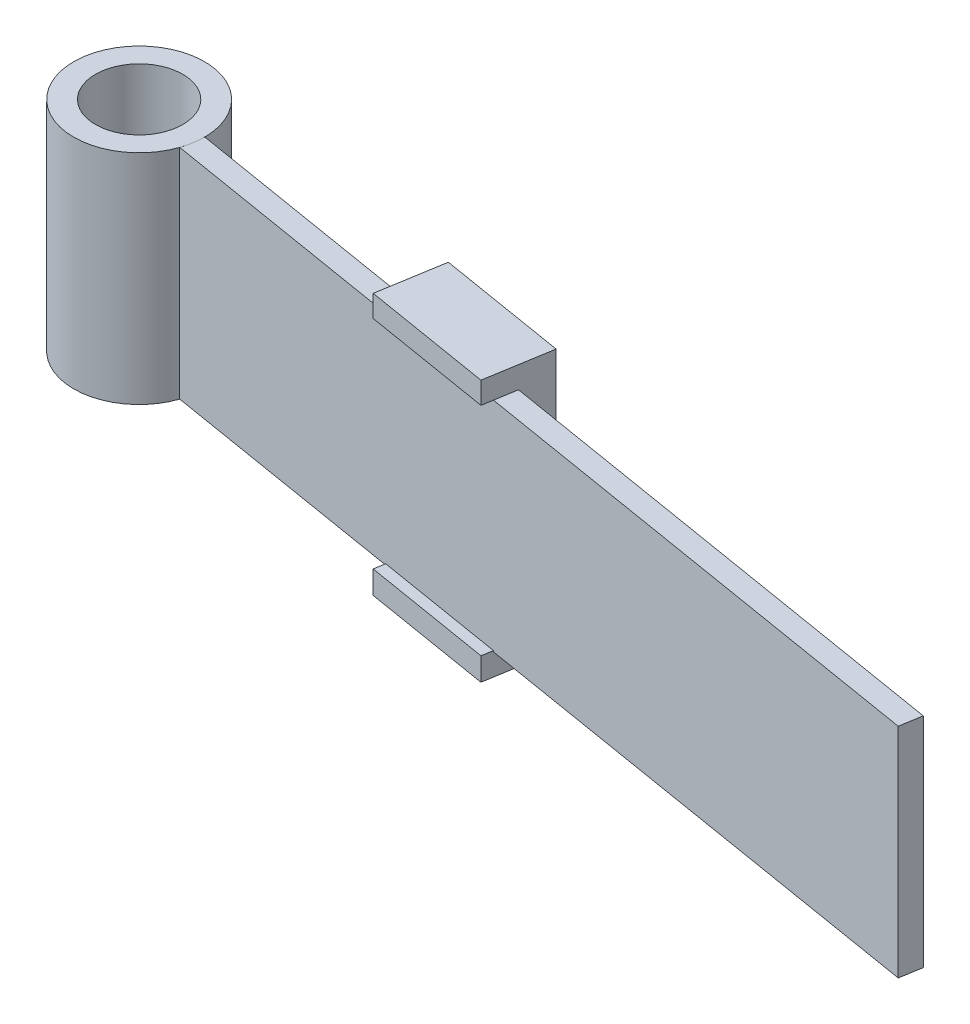
ISO-10303-21;
HEADER;
FILE_DESCRIPTION(('STEP AP214'),'2;1');
FILE_NAME('part.step','',(''),(''),'','','');
FILE_SCHEMA(('AUTOMOTIVE_DESIGN { 1 0 10303 214 1 1 1 1 }'));
ENDSEC;
DATA;
#1=APPLICATION_CONTEXT('core data for automotive mechanical design processes');
#2=APPLICATION_PROTOCOL_DEFINITION('international standard','automotive_design',2000,#1);
#3=PRODUCT_CONTEXT('',#1,'mechanical');
#4=PRODUCT('Part','Part','',(#3));
#5=PRODUCT_RELATED_PRODUCT_CATEGORY('part','',(#4));
#6=PRODUCT_DEFINITION_FORMATION('','',#4);
#7=PRODUCT_DEFINITION_CONTEXT('part definition',#1,'design');
#8=PRODUCT_DEFINITION('design','',#6,#7);
#9=PRODUCT_DEFINITION_SHAPE('','',#8);
#10=(LENGTH_UNIT() NAMED_UNIT(*) SI_UNIT(.MILLI.,.METRE.));
#11=(NAMED_UNIT(*) PLANE_ANGLE_UNIT() SI_UNIT($,.RADIAN.));
#12=(NAMED_UNIT(*) SI_UNIT($,.STERADIAN.) SOLID_ANGLE_UNIT());
#13=UNCERTAINTY_MEASURE_WITH_UNIT(LENGTH_MEASURE(1.E-05),#10,'distance_accuracy_value','');
#14=(GEOMETRIC_REPRESENTATION_CONTEXT(3) GLOBAL_UNCERTAINTY_ASSIGNED_CONTEXT((#13)) GLOBAL_UNIT_ASSIGNED_CONTEXT((#10,
#11,#12)) REPRESENTATION_CONTEXT('',''));
#15=CARTESIAN_POINT('',(0.,0.,0.));
#16=DIRECTION('',(0.,0.,1.));
#17=DIRECTION('',(1.,0.,0.));
#18=AXIS2_PLACEMENT_3D('',#15,#16,#17);
#19=CARTESIAN_POINT('',(-16.9690297326158,61.887307151711,30.7149030524795));
#20=DIRECTION('',(0.,-1.,0.));
#21=DIRECTION('',(0.,0.,-1.));
#22=AXIS2_PLACEMENT_3D('',#19,#20,#21);
#23=CYLINDRICAL_SURFACE('',#22,3.81);
#24=CARTESIAN_POINT('',(-16.9690297326158,61.887307151711,30.7149030524795));
#25=DIRECTION('',(0.,1.,0.));
#26=DIRECTION('',(0.,0.,1.));
#27=AXIS2_PLACEMENT_3D('',#24,#25,#26);
#28=CIRCLE('',#27,3.81);
#29=CARTESIAN_POINT('',(-16.9690297326158,61.887307151711,34.5249030524795));
#30=VERTEX_POINT('',#29);
#31=EDGE_CURVE('P0_E10',#30,#30,#28,.T.);
#32=ORIENTED_EDGE('',*,*,#31,.F.);
#33=EDGE_LOOP('',(#32));
#34=FACE_BOUND('',#33,.T.);
#35=CARTESIAN_POINT('',(-16.9690297326158,49.187307151711,30.7149030524795));
#36=DIRECTION('',(0.,1.,0.));
#37=DIRECTION('',(0.,0.,1.));
#38=AXIS2_PLACEMENT_3D('',#35,#36,#37);
#39=CIRCLE('',#38,3.81);
#40=CARTESIAN_POINT('',(-16.9690297326158,49.187307151711,34.5249030524795));
#41=VERTEX_POINT('',#40);
#42=EDGE_CURVE('P0_E18',#41,#41,#39,.T.);
#43=ORIENTED_EDGE('',*,*,#42,.T.);
#44=EDGE_LOOP('',(#43));
#45=FACE_BOUND('',#44,.T.);
#46=ADVANCED_FACE('P0_F15',(#34,#45),#23,.T.);
#47=CARTESIAN_POINT('',(-16.9690297326158,61.887307151711,30.7149030524795));
#48=DIRECTION('',(0.,1.,0.));
#49=DIRECTION('',(0.,0.,1.));
#50=AXIS2_PLACEMENT_3D('',#47,#48,#49);
#51=PLANE('',#50);
#52=CARTESIAN_POINT('',(-16.9690297326158,61.887307151711,30.7149030524795));
#53=DIRECTION('',(0.,1.,0.));
#54=DIRECTION('',(0.,0.,1.));
#55=AXIS2_PLACEMENT_3D('',#52,#53,#54);
#56=CIRCLE('',#55,2.54);
#57=CARTESIAN_POINT('',(-16.9690297326158,61.887307151711,33.2549030524795));
#58=VERTEX_POINT('',#57);
#59=EDGE_CURVE('P0_E27',#58,#58,#56,.T.);
#60=ORIENTED_EDGE('',*,*,#59,.F.);
#61=EDGE_LOOP('',(#60));
#62=FACE_BOUND('',#61,.T.);
#63=ORIENTED_EDGE('',*,*,#31,.T.);
#64=EDGE_LOOP('',(#63));
#65=FACE_BOUND('',#64,.T.);
#66=ADVANCED_FACE('P0_F42',(#62,#65),#51,.T.);
#67=CARTESIAN_POINT('',(-16.9690297326158,49.187307151711,30.7149030524795));
#68=DIRECTION('',(0.,1.,0.));
#69=DIRECTION('',(0.,0.,1.));
#70=AXIS2_PLACEMENT_3D('',#67,#68,#69);
#71=PLANE('',#70);
#72=CARTESIAN_POINT('',(-16.9690297326158,49.187307151711,30.7149030524795));
#73=DIRECTION('',(0.,1.,0.));
#74=DIRECTION('',(0.,0.,1.));
#75=AXIS2_PLACEMENT_3D('',#72,#73,#74);
#76=CIRCLE('',#75,2.54);
#77=CARTESIAN_POINT('',(-16.9690297326158,49.187307151711,33.2549030524795));
#78=VERTEX_POINT('',#77);
#79=EDGE_CURVE('P0_E25',#78,#78,#76,.T.);
#80=ORIENTED_EDGE('',*,*,#79,.T.);
#81=EDGE_LOOP('',(#80));
#82=FACE_BOUND('',#81,.T.);
#83=ORIENTED_EDGE('',*,*,#42,.F.);
#84=EDGE_LOOP('',(#83));
#85=FACE_BOUND('',#84,.T.);
#86=ADVANCED_FACE('P0_F33',(#82,#85),#71,.F.);
#87=CARTESIAN_POINT('',(-16.9690297326158,49.187307151711,30.7149030524795));
#88=DIRECTION('',(0.,1.,0.));
#89=DIRECTION('',(0.,0.,1.));
#90=AXIS2_PLACEMENT_3D('',#87,#88,#89);
#91=CYLINDRICAL_SURFACE('',#90,2.54);
#92=ORIENTED_EDGE('',*,*,#79,.F.);
#93=EDGE_LOOP('',(#92));
#94=FACE_BOUND('',#93,.T.);
#95=ORIENTED_EDGE('',*,*,#59,.T.);
#96=EDGE_LOOP('',(#95));
#97=FACE_BOUND('',#96,.T.);
#98=ADVANCED_FACE('P0_F36',(#94,#97),#91,.F.);
#99=CLOSED_SHELL('',(#46,#66,#86,#98));
#100=MANIFOLD_SOLID_BREP('P0_B1',#99);
#101=CARTESIAN_POINT('',(-13.159057779006,61.887307151711,30.7002841361616));
#102=DIRECTION('',(0.,-1.,0.));
#103=DIRECTION('',(-0.162882120661811,0.,0.986645536537166));
#104=AXIS2_PLACEMENT_3D('',#101,#102,#103);
#105=PLANE('',#104);
#106=DIRECTION('',(0.986645536537166,0.,0.162882120661811));
#107=VECTOR('',#106,1.);
#108=CARTESIAN_POINT('',(-13.159057779006,61.887307151711,30.7002841361616));
#109=LINE('',#108,#107);
#110=CARTESIAN_POINT('',(-13.159057779006,61.887307151711,30.7002841361616));
#111=VERTEX_POINT('',#110);
#112=CARTESIAN_POINT('',(36.962535477082,61.8873071517111,38.9746958657816));
#113=VERTEX_POINT('',#112);
#114=EDGE_CURVE('P1_E10',#111,#113,#109,.T.);
#115=ORIENTED_EDGE('',*,*,#114,.F.);
#116=CARTESIAN_POINT('',(-16.9690297326148,61.887307151711,30.7149030524796));
#117=DIRECTION('',(0.,-1.,0.));
#118=DIRECTION('',(-0.162882120661811,0.,0.986645536537166));
#119=AXIS2_PLACEMENT_3D('',#116,#117,#118);
#120=CIRCLE('',#119,3.81);
#121=CARTESIAN_POINT('',(-13.3659180722465,61.887307151711,31.9533239675638));
#122=VERTEX_POINT('',#121);
#123=EDGE_CURVE('P1_E82',#111,#122,#120,.T.);
#124=ORIENTED_EDGE('',*,*,#123,.T.);
#125=DIRECTION('',(0.986645536537166,0.,0.162882120661811));
#126=VECTOR('',#125,1.);
#127=CARTESIAN_POINT('',(-13.3659180722465,61.887307151711,31.9533239675638));
#128=LINE('',#127,#126);
#129=CARTESIAN_POINT('',(36.7556751838415,61.8873071517111,40.2277356971838));
#130=VERTEX_POINT('',#129);
#131=EDGE_CURVE('P1_E64',#122,#130,#128,.T.);
#132=ORIENTED_EDGE('',*,*,#131,.T.);
#133=DIRECTION('',(0.162882120661811,0.,-0.986645536537166));
#134=VECTOR('',#133,1.);
#135=CARTESIAN_POINT('',(36.962535477082,61.8873071517111,38.9746958657816));
#136=LINE('',#135,#134);
#137=EDGE_CURVE('P1_E69',#130,#113,#136,.T.);
#138=ORIENTED_EDGE('',*,*,#137,.T.);
#139=EDGE_LOOP('',(#115,#124,#132,#138));
#140=FACE_BOUND('',#139,.T.);
#141=ADVANCED_FACE('P1_F16',(#140),#105,.F.);
#142=CARTESIAN_POINT('',(-13.159057779006,49.187307151711,30.7002841361616));
#143=DIRECTION('',(-0.162882120661811,0.,0.986645536537166));
#144=DIRECTION('',(0.,1.,0.));
#145=AXIS2_PLACEMENT_3D('',#142,#143,#144);
#146=PLANE('',#145);
#147=DIRECTION('',(0.,-1.,0.));
#148=VECTOR('',#147,1.);
#149=CARTESIAN_POINT('',(36.962535477082,49.1873071517111,38.9746958657816));
#150=LINE('',#149,#148);
#151=CARTESIAN_POINT('',(36.962535477082,49.1873071517111,38.9746958657816));
#152=VERTEX_POINT('',#151);
#153=EDGE_CURVE('P1_E57',#113,#152,#150,.T.);
#154=ORIENTED_EDGE('',*,*,#153,.T.);
#155=DIRECTION('',(0.986645536537166,0.,0.162882120661811));
#156=VECTOR('',#155,1.);
#157=CARTESIAN_POINT('',(-13.159057779006,49.187307151711,30.7002841361616));
#158=LINE('',#157,#156);
#159=CARTESIAN_POINT('',(-13.159057779006,49.187307151711,30.7002841361616));
#160=VERTEX_POINT('',#159);
#161=EDGE_CURVE('P1_E24',#160,#152,#158,.T.);
#162=ORIENTED_EDGE('',*,*,#161,.F.);
#163=DIRECTION('',(0.,-1.,0.));
#164=VECTOR('',#163,1.);
#165=CARTESIAN_POINT('',(-13.159057779006,49.187307151711,30.7002841361616));
#166=LINE('',#165,#164);
#167=EDGE_CURVE('P1_E70',#111,#160,#166,.T.);
#168=ORIENTED_EDGE('',*,*,#167,.F.);
#169=ORIENTED_EDGE('',*,*,#114,.T.);
#170=EDGE_LOOP('',(#154,#162,#168,#169));
#171=FACE_BOUND('',#170,.T.);
#172=ADVANCED_FACE('P1_F84',(#171),#146,.F.);
#173=CARTESIAN_POINT('',(-13.159057779006,49.187307151711,30.7002841361616));
#174=DIRECTION('',(0.,1.,0.));
#175=DIRECTION('',(0.162882120661811,0.,-0.986645536537166));
#176=AXIS2_PLACEMENT_3D('',#173,#174,#175);
#177=PLANE('',#176);
#178=DIRECTION('',(0.986645536537166,0.,0.162882120661811));
#179=VECTOR('',#178,1.);
#180=CARTESIAN_POINT('',(-13.3659180722465,49.187307151711,31.9533239675638));
#181=LINE('',#180,#179);
#182=CARTESIAN_POINT('',(-13.3659180722465,49.187307151711,31.9533239675638));
#183=VERTEX_POINT('',#182);
#184=CARTESIAN_POINT('',(36.7556751838415,49.1873071517111,40.2277356971838));
#185=VERTEX_POINT('',#184);
#186=EDGE_CURVE('P1_E51',#183,#185,#181,.T.);
#187=ORIENTED_EDGE('',*,*,#186,.F.);
#188=CARTESIAN_POINT('',(-16.9690297326148,49.187307151711,30.7149030524796));
#189=DIRECTION('',(0.,-1.,0.));
#190=DIRECTION('',(-0.162882120661811,0.,0.986645536537166));
#191=AXIS2_PLACEMENT_3D('',#188,#189,#190);
#192=CIRCLE('',#191,3.81);
#193=EDGE_CURVE('P1_E31',#160,#183,#192,.T.);
#194=ORIENTED_EDGE('',*,*,#193,.F.);
#195=ORIENTED_EDGE('',*,*,#161,.T.);
#196=DIRECTION('',(-0.162882120661811,0.,0.986645536537166));
#197=VECTOR('',#196,1.);
#198=CARTESIAN_POINT('',(36.962535477082,49.1873071517111,38.9746958657816));
#199=LINE('',#198,#197);
#200=EDGE_CURVE('P1_E48',#152,#185,#199,.T.);
#201=ORIENTED_EDGE('',*,*,#200,.T.);
#202=EDGE_LOOP('',(#187,#194,#195,#201));
#203=FACE_BOUND('',#202,.T.);
#204=ADVANCED_FACE('P1_F50',(#203),#177,.F.);
#205=CARTESIAN_POINT('',(-13.3659180722465,49.187307151711,31.9533239675638));
#206=DIRECTION('',(0.162882120661811,0.,-0.986645536537166));
#207=DIRECTION('',(0.,-1.,0.));
#208=AXIS2_PLACEMENT_3D('',#205,#206,#207);
#209=PLANE('',#208);
#210=DIRECTION('',(0.,1.,0.));
#211=VECTOR('',#210,1.);
#212=CARTESIAN_POINT('',(36.7556751838415,49.1873071517111,40.2277356971838));
#213=LINE('',#212,#211);
#214=EDGE_CURVE('P1_E56',#185,#130,#213,.T.);
#215=ORIENTED_EDGE('',*,*,#214,.T.);
#216=ORIENTED_EDGE('',*,*,#131,.F.);
#217=DIRECTION('',(0.,1.,0.));
#218=VECTOR('',#217,1.);
#219=CARTESIAN_POINT('',(-13.3659180722465,49.187307151711,31.9533239675638));
#220=LINE('',#219,#218);
#221=EDGE_CURVE('P1_E63',#183,#122,#220,.T.);
#222=ORIENTED_EDGE('',*,*,#221,.F.);
#223=ORIENTED_EDGE('',*,*,#186,.T.);
#224=EDGE_LOOP('',(#215,#216,#222,#223));
#225=FACE_BOUND('',#224,.T.);
#226=ADVANCED_FACE('P1_F60',(#225),#209,.F.);
#227=CARTESIAN_POINT('',(36.8591053304618,55.5373071517111,39.6012157814827));
#228=DIRECTION('',(-0.986645536537166,0.,-0.162882120661811));
#229=DIRECTION('',(0.162882120661811,0.,-0.986645536537166));
#230=AXIS2_PLACEMENT_3D('',#227,#228,#229);
#231=PLANE('',#230);
#232=ORIENTED_EDGE('',*,*,#137,.F.);
#233=ORIENTED_EDGE('',*,*,#214,.F.);
#234=ORIENTED_EDGE('',*,*,#200,.F.);
#235=ORIENTED_EDGE('',*,*,#153,.F.);
#236=EDGE_LOOP('',(#232,#233,#234,#235));
#237=FACE_BOUND('',#236,.T.);
#238=ADVANCED_FACE('P1_F67',(#237),#231,.F.);
#239=CARTESIAN_POINT('',(-16.9690297326148,99.987307151711,30.7149030524796));
#240=DIRECTION('',(0.,-1.,0.));
#241=DIRECTION('',(-0.162882120661811,0.,0.986645536537166));
#242=AXIS2_PLACEMENT_3D('',#239,#240,#241);
#243=CYLINDRICAL_SURFACE('',#242,3.81);
#244=ORIENTED_EDGE('',*,*,#167,.T.);
#245=ORIENTED_EDGE('',*,*,#193,.T.);
#246=ORIENTED_EDGE('',*,*,#221,.T.);
#247=ORIENTED_EDGE('',*,*,#123,.F.);
#248=EDGE_LOOP('',(#244,#245,#246,#247));
#249=FACE_BOUND('',#248,.T.);
#250=ADVANCED_FACE('P1_F102',(#249),#243,.F.);
#251=CLOSED_SHELL('',(#141,#172,#204,#226,#238,#250));
#252=MANIFOLD_SOLID_BREP('P1_B1',#251);
#253=CARTESIAN_POINT('',(4.96786304614483,55.5373071517111,33.6927988699047));
#254=DIRECTION('',(-0.162882120661811,0.,0.986645536537166));
#255=DIRECTION('',(0.986645536537166,0.,0.162882120661811));
#256=AXIS2_PLACEMENT_3D('',#253,#254,#255);
#257=PLANE('',#256);
#258=DIRECTION('',(0.,1.,0.));
#259=VECTOR('',#258,1.);
#260=CARTESIAN_POINT('',(8.72698254035141,63.1573071517111,34.3133797496262));
#261=LINE('',#260,#259);
#262=CARTESIAN_POINT('',(8.72698254035146,49.254888550921,34.3133797496262));
#263=VERTEX_POINT('',#262);
#264=CARTESIAN_POINT('',(8.72698254035141,61.8873071517111,34.3133797496262));
#265=VERTEX_POINT('',#264);
#266=EDGE_CURVE('P2_E37',#263,#265,#261,.T.);
#267=ORIENTED_EDGE('',*,*,#266,.T.);
#268=DIRECTION('',(0.986645536537165,0.,0.162882120661811));
#269=VECTOR('',#268,1.);
#270=CARTESIAN_POINT('',(1.20874355193821,61.8873071517111,33.0722179901832));
#271=LINE('',#270,#269);
#272=CARTESIAN_POINT('',(1.20874355193821,61.8873071517111,33.0722179901832));
#273=VERTEX_POINT('',#272);
#274=EDGE_CURVE('P2_E32',#273,#265,#271,.T.);
#275=ORIENTED_EDGE('',*,*,#274,.F.);
#276=DIRECTION('',(0.,-1.,0.));
#277=VECTOR('',#276,1.);
#278=CARTESIAN_POINT('',(1.20874355193821,63.1573071517111,33.0722179901832));
#279=LINE('',#278,#277);
#280=CARTESIAN_POINT('',(1.20874355193825,49.2548885509209,33.0722179901832));
#281=VERTEX_POINT('',#280);
#282=EDGE_CURVE('P2_E135',#273,#281,#279,.T.);
#283=ORIENTED_EDGE('',*,*,#282,.T.);
#284=DIRECTION('',(-0.986645536537165,0.,-0.162882120661811));
#285=VECTOR('',#284,1.);
#286=CARTESIAN_POINT('',(8.72698254035146,49.2548885509209,34.3133797496262));
#287=LINE('',#286,#285);
#288=EDGE_CURVE('P2_E114',#263,#281,#287,.T.);
#289=ORIENTED_EDGE('',*,*,#288,.F.);
#290=EDGE_LOOP('',(#267,#275,#283,#289));
#291=FACE_BOUND('',#290,.T.);
#292=ADVANCED_FACE('P2_F17',(#291),#257,.T.);
#293=CARTESIAN_POINT('',(8.72698254035146,47.9173071517111,34.3133797496262));
#294=DIRECTION('',(0.,1.,0.));
#295=DIRECTION('',(-0.986645536537166,0.,-0.162882120661811));
#296=AXIS2_PLACEMENT_3D('',#293,#294,#295);
#297=PLANE('',#296);
#298=DIRECTION('',(0.986645536537165,0.,0.162882120661811));
#299=VECTOR('',#298,1.);
#300=CARTESIAN_POINT('',(9.03727298021221,47.9173071517111,32.4338200025229));
#301=LINE('',#300,#299);
#302=CARTESIAN_POINT('',(1.51903399179901,47.9173071517111,31.1926582430799));
#303=VERTEX_POINT('',#302);
#304=CARTESIAN_POINT('',(9.03727298021221,47.9173071517111,32.4338200025229));
#305=VERTEX_POINT('',#304);
#306=EDGE_CURVE('P2_E133',#303,#305,#301,.T.);
#307=ORIENTED_EDGE('',*,*,#306,.T.);
#308=DIRECTION('',(0.162882120661811,0.,-0.986645536537165));
#309=VECTOR('',#308,1.);
#310=CARTESIAN_POINT('',(8.72698254035146,47.9173071517111,34.3133797496262));
#311=LINE('',#310,#309);
#312=CARTESIAN_POINT('',(8.41669210049071,47.9173071517111,36.1929394967295));
#313=VERTEX_POINT('',#312);
#314=EDGE_CURVE('P2_E11',#313,#305,#311,.T.);
#315=ORIENTED_EDGE('',*,*,#314,.F.);
#316=DIRECTION('',(0.986645536537165,0.,0.162882120661811));
#317=VECTOR('',#316,1.);
#318=CARTESIAN_POINT('',(8.41669210049071,47.9173071517111,36.1929394967295));
#319=LINE('',#318,#317);
#320=CARTESIAN_POINT('',(0.898453112077508,47.9173071517111,34.9517777372865));
#321=VERTEX_POINT('',#320);
#322=EDGE_CURVE('P2_E115',#321,#313,#319,.T.);
#323=ORIENTED_EDGE('',*,*,#322,.F.);
#324=DIRECTION('',(0.162882120661811,0.,-0.986645536537165));
#325=VECTOR('',#324,1.);
#326=CARTESIAN_POINT('',(1.20874355193826,47.9173071517111,33.0722179901832));
#327=LINE('',#326,#325);
#328=EDGE_CURVE('P2_E90',#321,#303,#327,.T.);
#329=ORIENTED_EDGE('',*,*,#328,.T.);
#330=EDGE_LOOP('',(#307,#315,#323,#329));
#331=FACE_BOUND('',#330,.T.);
#332=ADVANCED_FACE('P2_F19',(#331),#297,.F.);
#333=CARTESIAN_POINT('',(8.72698254035141,63.1573071517111,34.3133797496262));
#334=DIRECTION('',(-0.986645536537166,0.,-0.162882120661811));
#335=DIRECTION('',(0.,-1.,0.));
#336=AXIS2_PLACEMENT_3D('',#333,#334,#335);
#337=PLANE('',#336);
#338=DIRECTION('',(0.,1.,0.));
#339=VECTOR('',#338,1.);
#340=CARTESIAN_POINT('',(9.03727298021216,63.1573071517111,32.4338200025229));
#341=LINE('',#340,#339);
#342=CARTESIAN_POINT('',(9.03727298021216,63.1573071517111,32.4338200025229));
#343=VERTEX_POINT('',#342);
#344=EDGE_CURVE('P2_E140',#305,#343,#341,.T.);
#345=ORIENTED_EDGE('',*,*,#344,.T.);
#346=DIRECTION('',(0.162882120661811,0.,-0.986645536537165));
#347=VECTOR('',#346,1.);
#348=CARTESIAN_POINT('',(8.72698254035141,63.1573071517111,34.3133797496262));
#349=LINE('',#348,#347);
#350=CARTESIAN_POINT('',(8.41669210049066,63.1573071517111,36.1929394967295));
#351=VERTEX_POINT('',#350);
#352=EDGE_CURVE('P2_E25',#351,#343,#349,.T.);
#353=ORIENTED_EDGE('',*,*,#352,.F.);
#354=DIRECTION('',(0.,1.,0.));
#355=VECTOR('',#354,1.);
#356=CARTESIAN_POINT('',(8.41669210049066,63.1573071517111,36.1929394967295));
#357=LINE('',#356,#355);
#358=CARTESIAN_POINT('',(8.41669210049066,61.8873071517111,36.1929394967295));
#359=VERTEX_POINT('',#358);
#360=EDGE_CURVE('P2_E104',#359,#351,#357,.T.);
#361=ORIENTED_EDGE('',*,*,#360,.F.);
#362=DIRECTION('',(0.162882120661811,0.,-0.986645536537165));
#363=VECTOR('',#362,1.);
#364=CARTESIAN_POINT('',(8.41669210049066,61.8873071517111,36.1929394967295));
#365=LINE('',#364,#363);
#366=EDGE_CURVE('P2_E109',#359,#265,#365,.T.);
#367=ORIENTED_EDGE('',*,*,#366,.T.);
#368=ORIENTED_EDGE('',*,*,#266,.F.);
#369=DIRECTION('',(0.162882120661811,0.,-0.986645536537165));
#370=VECTOR('',#369,1.);
#371=CARTESIAN_POINT('',(8.41669210049071,49.2548885509209,36.1929394967295));
#372=LINE('',#371,#370);
#373=CARTESIAN_POINT('',(8.41669210049071,49.2548885509209,36.1929394967295));
#374=VERTEX_POINT('',#373);
#375=EDGE_CURVE('P2_E130',#374,#263,#372,.T.);
#376=ORIENTED_EDGE('',*,*,#375,.F.);
#377=DIRECTION('',(0.,1.,0.));
#378=VECTOR('',#377,1.);
#379=CARTESIAN_POINT('',(8.41669210049071,47.9173071517111,36.1929394967295));
#380=LINE('',#379,#378);
#381=EDGE_CURVE('P2_E118',#313,#374,#380,.T.);
#382=ORIENTED_EDGE('',*,*,#381,.F.);
#383=ORIENTED_EDGE('',*,*,#314,.T.);
#384=EDGE_LOOP('',(#345,#353,#361,#367,#368,#376,#382,#383));
#385=FACE_BOUND('',#384,.T.);
#386=ADVANCED_FACE('P2_F160',(#385),#337,.F.);
#387=CARTESIAN_POINT('',(8.72698254035141,63.1573071517111,34.3133797496262));
#388=DIRECTION('',(0.,-1.,0.));
#389=DIRECTION('',(0.986645536537166,0.,0.162882120661811));
#390=AXIS2_PLACEMENT_3D('',#387,#388,#389);
#391=PLANE('',#390);
#392=DIRECTION('',(-0.986645536537165,0.,-0.162882120661811));
#393=VECTOR('',#392,1.);
#394=CARTESIAN_POINT('',(9.03727298021216,63.1573071517111,32.4338200025229));
#395=LINE('',#394,#393);
#396=CARTESIAN_POINT('',(1.51903399179896,63.1573071517111,31.1926582430799));
#397=VERTEX_POINT('',#396);
#398=EDGE_CURVE('P2_E87',#343,#397,#395,.T.);
#399=ORIENTED_EDGE('',*,*,#398,.T.);
#400=DIRECTION('',(0.162882120661811,0.,-0.986645536537165));
#401=VECTOR('',#400,1.);
#402=CARTESIAN_POINT('',(1.20874355193821,63.1573071517111,33.0722179901832));
#403=LINE('',#402,#401);
#404=CARTESIAN_POINT('',(0.898453112077458,63.1573071517111,34.9517777372865));
#405=VERTEX_POINT('',#404);
#406=EDGE_CURVE('P2_E80',#405,#397,#403,.T.);
#407=ORIENTED_EDGE('',*,*,#406,.F.);
#408=DIRECTION('',(-0.986645536537165,0.,-0.162882120661811));
#409=VECTOR('',#408,1.);
#410=CARTESIAN_POINT('',(0.898453112077458,63.1573071517111,34.9517777372865));
#411=LINE('',#410,#409);
#412=EDGE_CURVE('P2_E85',#351,#405,#411,.T.);
#413=ORIENTED_EDGE('',*,*,#412,.F.);
#414=ORIENTED_EDGE('',*,*,#352,.T.);
#415=EDGE_LOOP('',(#399,#407,#413,#414));
#416=FACE_BOUND('',#415,.T.);
#417=ADVANCED_FACE('P2_F82',(#416),#391,.F.);
#418=CARTESIAN_POINT('',(1.20874355193821,63.1573071517111,33.0722179901832));
#419=DIRECTION('',(0.986645536537166,0.,0.162882120661811));
#420=DIRECTION('',(0.,1.,0.));
#421=AXIS2_PLACEMENT_3D('',#418,#419,#420);
#422=PLANE('',#421);
#423=DIRECTION('',(0.,-1.,0.));
#424=VECTOR('',#423,1.);
#425=CARTESIAN_POINT('',(1.51903399179896,63.1573071517111,31.1926582430799));
#426=LINE('',#425,#424);
#427=EDGE_CURVE('P2_E136',#397,#303,#426,.T.);
#428=ORIENTED_EDGE('',*,*,#427,.T.);
#429=ORIENTED_EDGE('',*,*,#328,.F.);
#430=DIRECTION('',(0.,-1.,0.));
#431=VECTOR('',#430,1.);
#432=CARTESIAN_POINT('',(0.898453112077508,47.9173071517111,34.9517777372865));
#433=LINE('',#432,#431);
#434=CARTESIAN_POINT('',(0.898453112077504,49.2548885509209,34.9517777372865));
#435=VERTEX_POINT('',#434);
#436=EDGE_CURVE('P2_E122',#435,#321,#433,.T.);
#437=ORIENTED_EDGE('',*,*,#436,.F.);
#438=DIRECTION('',(0.162882120661811,0.,-0.986645536537165));
#439=VECTOR('',#438,1.);
#440=CARTESIAN_POINT('',(0.898453112077504,49.2548885509209,34.9517777372865));
#441=LINE('',#440,#439);
#442=EDGE_CURVE('P2_E125',#435,#281,#441,.T.);
#443=ORIENTED_EDGE('',*,*,#442,.T.);
#444=ORIENTED_EDGE('',*,*,#282,.F.);
#445=DIRECTION('',(0.162882120661811,0.,-0.986645536537165));
#446=VECTOR('',#445,1.);
#447=CARTESIAN_POINT('',(0.898453112077462,61.8873071517111,34.9517777372865));
#448=LINE('',#447,#446);
#449=CARTESIAN_POINT('',(0.898453112077462,61.8873071517111,34.9517777372865));
#450=VERTEX_POINT('',#449);
#451=EDGE_CURVE('P2_E96',#450,#273,#448,.T.);
#452=ORIENTED_EDGE('',*,*,#451,.F.);
#453=DIRECTION('',(0.,-1.,0.));
#454=VECTOR('',#453,1.);
#455=CARTESIAN_POINT('',(0.898453112077458,63.1573071517111,34.9517777372865));
#456=LINE('',#455,#454);
#457=EDGE_CURVE('P2_E93',#405,#450,#456,.T.);
#458=ORIENTED_EDGE('',*,*,#457,.F.);
#459=ORIENTED_EDGE('',*,*,#406,.T.);
#460=EDGE_LOOP('',(#428,#429,#437,#443,#444,#452,#458,#459));
#461=FACE_BOUND('',#460,.T.);
#462=ADVANCED_FACE('P2_F94',(#461),#422,.F.);
#463=CARTESIAN_POINT('',(5.27815348600558,55.5373071517111,31.8132391228014));
#464=DIRECTION('',(-0.162882120661811,0.,0.986645536537166));
#465=DIRECTION('',(0.986645536537166,0.,0.162882120661811));
#466=AXIS2_PLACEMENT_3D('',#463,#464,#465);
#467=PLANE('',#466);
#468=ORIENTED_EDGE('',*,*,#306,.F.);
#469=ORIENTED_EDGE('',*,*,#427,.F.);
#470=ORIENTED_EDGE('',*,*,#398,.F.);
#471=ORIENTED_EDGE('',*,*,#344,.F.);
#472=EDGE_LOOP('',(#468,#469,#470,#471));
#473=FACE_BOUND('',#472,.T.);
#474=ADVANCED_FACE('P2_F148',(#473),#467,.F.);
#475=CARTESIAN_POINT('',(8.41669210049071,49.2548885509209,36.1929394967295));
#476=DIRECTION('',(0.,-1.,0.));
#477=DIRECTION('',(0.986645536537166,0.,0.162882120661811));
#478=AXIS2_PLACEMENT_3D('',#475,#476,#477);
#479=PLANE('',#478);
#480=ORIENTED_EDGE('',*,*,#288,.T.);
#481=ORIENTED_EDGE('',*,*,#442,.F.);
#482=DIRECTION('',(-0.986645536537165,0.,-0.162882120661811));
#483=VECTOR('',#482,1.);
#484=CARTESIAN_POINT('',(8.41669210049071,49.2548885509209,36.1929394967295));
#485=LINE('',#484,#483);
#486=EDGE_CURVE('P2_E120',#374,#435,#485,.T.);
#487=ORIENTED_EDGE('',*,*,#486,.F.);
#488=ORIENTED_EDGE('',*,*,#375,.T.);
#489=EDGE_LOOP('',(#480,#481,#487,#488));
#490=FACE_BOUND('',#489,.T.);
#491=ADVANCED_FACE('P2_F159',(#490),#479,.F.);
#492=CARTESIAN_POINT('',(4.65757260628408,55.5373071517111,35.572358617008));
#493=DIRECTION('',(0.162882120661811,0.,-0.986645536537166));
#494=DIRECTION('',(-0.986645536537166,0.,-0.162882120661811));
#495=AXIS2_PLACEMENT_3D('',#492,#493,#494);
#496=PLANE('',#495);
#497=ORIENTED_EDGE('',*,*,#322,.T.);
#498=ORIENTED_EDGE('',*,*,#381,.T.);
#499=ORIENTED_EDGE('',*,*,#486,.T.);
#500=ORIENTED_EDGE('',*,*,#436,.T.);
#501=EDGE_LOOP('',(#497,#498,#499,#500));
#502=FACE_BOUND('',#501,.T.);
#503=ADVANCED_FACE('P2_F154',(#502),#496,.F.);
#504=CARTESIAN_POINT('',(0.898453112077462,61.8873071517111,34.9517777372865));
#505=DIRECTION('',(0.,1.,0.));
#506=DIRECTION('',(-0.986645536537166,0.,-0.162882120661811));
#507=AXIS2_PLACEMENT_3D('',#504,#505,#506);
#508=PLANE('',#507);
#509=ORIENTED_EDGE('',*,*,#274,.T.);
#510=ORIENTED_EDGE('',*,*,#366,.F.);
#511=DIRECTION('',(0.986645536537165,0.,0.162882120661811));
#512=VECTOR('',#511,1.);
#513=CARTESIAN_POINT('',(0.898453112077462,61.8873071517111,34.9517777372865));
#514=LINE('',#513,#512);
#515=EDGE_CURVE('P2_E99',#450,#359,#514,.T.);
#516=ORIENTED_EDGE('',*,*,#515,.F.);
#517=ORIENTED_EDGE('',*,*,#451,.T.);
#518=EDGE_LOOP('',(#509,#510,#516,#517));
#519=FACE_BOUND('',#518,.T.);
#520=ADVANCED_FACE('P2_F163',(#519),#508,.F.);
#521=CARTESIAN_POINT('',(4.65757260628408,55.5373071517111,35.572358617008));
#522=DIRECTION('',(0.162882120661811,0.,-0.986645536537166));
#523=DIRECTION('',(-0.986645536537166,0.,-0.162882120661811));
#524=AXIS2_PLACEMENT_3D('',#521,#522,#523);
#525=PLANE('',#524);
#526=ORIENTED_EDGE('',*,*,#412,.T.);
#527=ORIENTED_EDGE('',*,*,#457,.T.);
#528=ORIENTED_EDGE('',*,*,#515,.T.);
#529=ORIENTED_EDGE('',*,*,#360,.T.);
#530=EDGE_LOOP('',(#526,#527,#528,#529));
#531=FACE_BOUND('',#530,.T.);
#532=ADVANCED_FACE('P2_F102',(#531),#525,.F.);
#533=CLOSED_SHELL('',(#292,#332,#386,#417,#462,#474,#491,#503,#520,#532));
#534=MANIFOLD_SOLID_BREP('P2_B1',#533);
#535=ADVANCED_BREP_SHAPE_REPRESENTATION('',(#18,#100,#252,#534),#14);
#536=SHAPE_DEFINITION_REPRESENTATION(#9,#535);
ENDSEC;
END-ISO-10303-21;
